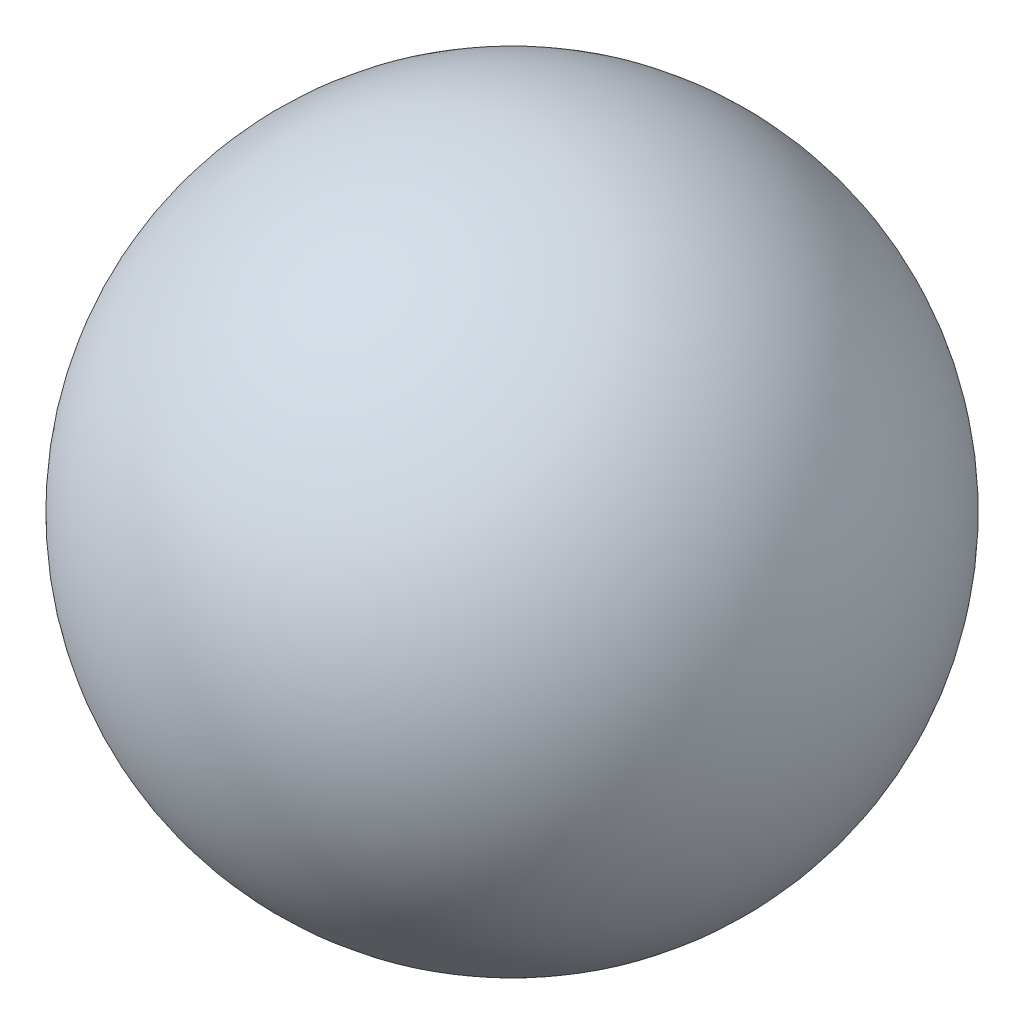
ISO-10303-21;
HEADER;
FILE_DESCRIPTION(('STEP AP214'),'2;1');
FILE_NAME('part.step','',(''),(''),'','','');
FILE_SCHEMA(('AUTOMOTIVE_DESIGN { 1 0 10303 214 1 1 1 1 }'));
ENDSEC;
DATA;
#1=APPLICATION_CONTEXT('core data for automotive mechanical design processes');
#2=APPLICATION_PROTOCOL_DEFINITION('international standard','automotive_design',2000,#1);
#3=PRODUCT_CONTEXT('',#1,'mechanical');
#4=PRODUCT('Part','Part','',(#3));
#5=PRODUCT_RELATED_PRODUCT_CATEGORY('part','',(#4));
#6=PRODUCT_DEFINITION_FORMATION('','',#4);
#7=PRODUCT_DEFINITION_CONTEXT('part definition',#1,'design');
#8=PRODUCT_DEFINITION('design','',#6,#7);
#9=PRODUCT_DEFINITION_SHAPE('','',#8);
#10=(LENGTH_UNIT() NAMED_UNIT(*) SI_UNIT(.MILLI.,.METRE.));
#11=(NAMED_UNIT(*) PLANE_ANGLE_UNIT() SI_UNIT($,.RADIAN.));
#12=(NAMED_UNIT(*) SI_UNIT($,.STERADIAN.) SOLID_ANGLE_UNIT());
#13=UNCERTAINTY_MEASURE_WITH_UNIT(LENGTH_MEASURE(1.E-05),#10,'distance_accuracy_value','');
#14=(GEOMETRIC_REPRESENTATION_CONTEXT(3) GLOBAL_UNCERTAINTY_ASSIGNED_CONTEXT((#13)) GLOBAL_UNIT_ASSIGNED_CONTEXT((#10,
#11,#12)) REPRESENTATION_CONTEXT('',''));
#15=CARTESIAN_POINT('',(0.,0.,0.));
#16=DIRECTION('',(0.,0.,1.));
#17=DIRECTION('',(1.,0.,0.));
#18=AXIS2_PLACEMENT_3D('',#15,#16,#17);
#19=CARTESIAN_POINT('',(0.,1.179195,0.));
#20=DIRECTION('',(0.,1.,0.));
#21=DIRECTION('',(-1.,0.,0.));
#22=AXIS2_PLACEMENT_3D('',#19,#20,#21);
#23=SPHERICAL_SURFACE('',#22,1.179195);
#24=CARTESIAN_POINT('',(0.,2.35839,0.));
#25=VERTEX_POINT('',#24);
#26=VERTEX_LOOP('',#25);
#27=FACE_BOUND('',#26,.T.);
#28=ADVANCED_FACE('F31',(#27),#23,.T.);
#29=CLOSED_SHELL('',(#28));
#30=MANIFOLD_SOLID_BREP('B2',#29);
#31=ADVANCED_BREP_SHAPE_REPRESENTATION('',(#18,#30),#14);
#32=SHAPE_DEFINITION_REPRESENTATION(#9,#31);
ENDSEC;
END-ISO-10303-21;
